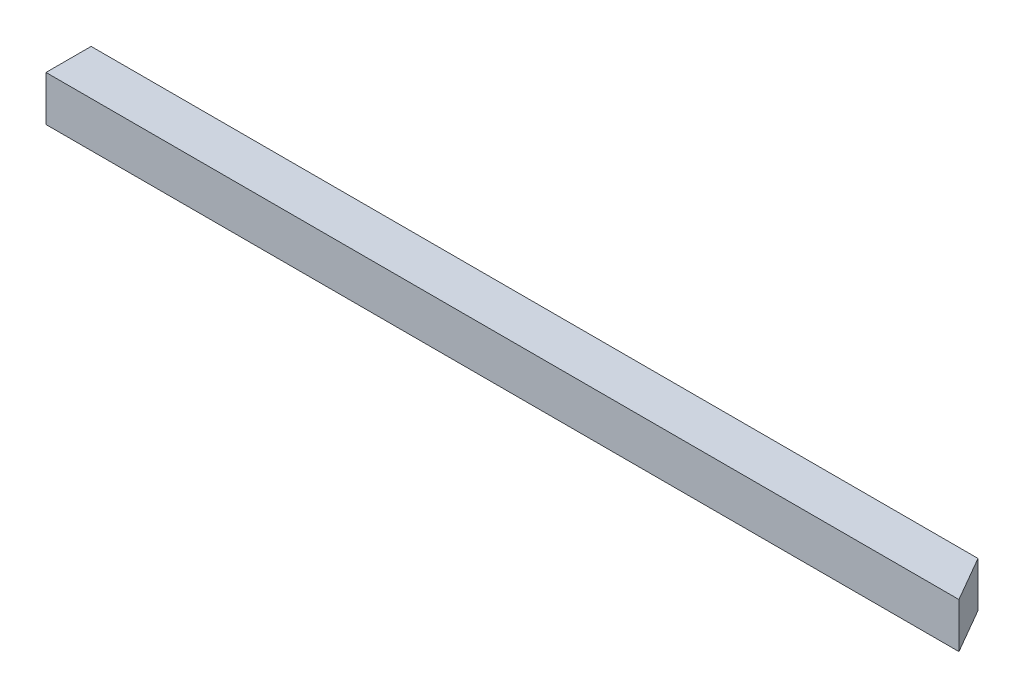
ISO-10303-21;
HEADER;
FILE_DESCRIPTION(('STEP AP214'),'2;1');
FILE_NAME('part.step','',(''),(''),'','','');
FILE_SCHEMA(('AUTOMOTIVE_DESIGN { 1 0 10303 214 1 1 1 1 }'));
ENDSEC;
DATA;
#1=APPLICATION_CONTEXT('core data for automotive mechanical design processes');
#2=APPLICATION_PROTOCOL_DEFINITION('international standard','automotive_design',2000,#1);
#3=PRODUCT_CONTEXT('',#1,'mechanical');
#4=PRODUCT('Part','Part','',(#3));
#5=PRODUCT_RELATED_PRODUCT_CATEGORY('part','',(#4));
#6=PRODUCT_DEFINITION_FORMATION('','',#4);
#7=PRODUCT_DEFINITION_CONTEXT('part definition',#1,'design');
#8=PRODUCT_DEFINITION('design','',#6,#7);
#9=PRODUCT_DEFINITION_SHAPE('','',#8);
#10=(LENGTH_UNIT() NAMED_UNIT(*) SI_UNIT(.MILLI.,.METRE.));
#11=(NAMED_UNIT(*) PLANE_ANGLE_UNIT() SI_UNIT($,.RADIAN.));
#12=(NAMED_UNIT(*) SI_UNIT($,.STERADIAN.) SOLID_ANGLE_UNIT());
#13=UNCERTAINTY_MEASURE_WITH_UNIT(LENGTH_MEASURE(1.E-05),#10,'distance_accuracy_value','');
#14=(GEOMETRIC_REPRESENTATION_CONTEXT(3) GLOBAL_UNCERTAINTY_ASSIGNED_CONTEXT((#13)) GLOBAL_UNIT_ASSIGNED_CONTEXT((#10,
#11,#12)) REPRESENTATION_CONTEXT('',''));
#15=CARTESIAN_POINT('',(0.,0.,0.));
#16=DIRECTION('',(0.,0.,1.));
#17=DIRECTION('',(1.,0.,0.));
#18=AXIS2_PLACEMENT_3D('',#15,#16,#17);
#19=CARTESIAN_POINT('',(503.094010767587,20.,563.730669589463));
#20=DIRECTION('',(-0.866025403784437,0.,0.500000000000003));
#21=DIRECTION('',(0.500000000000003,0.,0.866025403784437));
#22=AXIS2_PLACEMENT_3D('',#19,#20,#21);
#23=PLANE('',#22);
#24=DIRECTION('',(-0.500000000000003,0.,-0.866025403784437));
#25=VECTOR('',#24,1.);
#26=CARTESIAN_POINT('',(503.094010767587,0.,563.730669589463));
#27=LINE('',#26,#25);
#28=CARTESIAN_POINT('',(514.64101615138,0.,583.730669589463));
#29=VERTEX_POINT('',#28);
#30=CARTESIAN_POINT('',(503.094010767587,0.,563.730669589463));
#31=VERTEX_POINT('',#30);
#32=EDGE_CURVE('E90',#29,#31,#27,.T.);
#33=ORIENTED_EDGE('',*,*,#32,.T.);
#34=DIRECTION('',(0.,-1.,0.));
#35=VECTOR('',#34,1.);
#36=CARTESIAN_POINT('',(503.094010767587,20.,563.730669589463));
#37=LINE('',#36,#35);
#38=CARTESIAN_POINT('',(503.094010767587,20.,563.730669589463));
#39=VERTEX_POINT('',#38);
#40=EDGE_CURVE('E44',#39,#31,#37,.T.);
#41=ORIENTED_EDGE('',*,*,#40,.F.);
#42=DIRECTION('',(-0.500000000000003,0.,-0.866025403784437));
#43=VECTOR('',#42,1.);
#44=CARTESIAN_POINT('',(503.094010767587,20.,563.730669589463));
#45=LINE('',#44,#43);
#46=CARTESIAN_POINT('',(514.64101615138,20.,583.730669589463));
#47=VERTEX_POINT('',#46);
#48=EDGE_CURVE('E82',#47,#39,#45,.T.);
#49=ORIENTED_EDGE('',*,*,#48,.F.);
#50=DIRECTION('',(0.,-1.,0.));
#51=VECTOR('',#50,1.);
#52=CARTESIAN_POINT('',(514.64101615138,20.,583.730669589463));
#53=LINE('',#52,#51);
#54=EDGE_CURVE('E11',#47,#29,#53,.T.);
#55=ORIENTED_EDGE('',*,*,#54,.T.);
#56=EDGE_LOOP('',(#33,#41,#49,#55));
#57=FACE_BOUND('',#56,.T.);
#58=ADVANCED_FACE('F36',(#57),#23,.F.);
#59=CARTESIAN_POINT('',(110.000000000002,20.,563.730669589463));
#60=DIRECTION('',(0.,0.,1.));
#61=DIRECTION('',(1.,0.,0.));
#62=AXIS2_PLACEMENT_3D('',#59,#60,#61);
#63=PLANE('',#62);
#64=DIRECTION('',(-1.,0.,0.));
#65=VECTOR('',#64,1.);
#66=CARTESIAN_POINT('',(110.000000000002,0.,563.730669589463));
#67=LINE('',#66,#65);
#68=CARTESIAN_POINT('',(110.000000000002,0.,563.730669589463));
#69=VERTEX_POINT('',#68);
#70=EDGE_CURVE('E69',#31,#69,#67,.T.);
#71=ORIENTED_EDGE('',*,*,#70,.T.);
#72=DIRECTION('',(0.,-1.,0.));
#73=VECTOR('',#72,1.);
#74=CARTESIAN_POINT('',(110.000000000002,20.,563.730669589463));
#75=LINE('',#74,#73);
#76=CARTESIAN_POINT('',(110.000000000002,20.,563.730669589463));
#77=VERTEX_POINT('',#76);
#78=EDGE_CURVE('E91',#77,#69,#75,.T.);
#79=ORIENTED_EDGE('',*,*,#78,.F.);
#80=DIRECTION('',(-1.,0.,0.));
#81=VECTOR('',#80,1.);
#82=CARTESIAN_POINT('',(480.000000000002,20.,563.730669589463));
#83=LINE('',#82,#81);
#84=EDGE_CURVE('E86',#39,#77,#83,.T.);
#85=ORIENTED_EDGE('',*,*,#84,.F.);
#86=ORIENTED_EDGE('',*,*,#40,.T.);
#87=EDGE_LOOP('',(#71,#79,#85,#86));
#88=FACE_BOUND('',#87,.T.);
#89=ADVANCED_FACE('F92',(#88),#63,.F.);
#90=CARTESIAN_POINT('',(110.000000000002,20.,563.730669589463));
#91=DIRECTION('',(1.,0.,0.));
#92=DIRECTION('',(0.,0.,-1.));
#93=AXIS2_PLACEMENT_3D('',#90,#91,#92);
#94=PLANE('',#93);
#95=DIRECTION('',(0.,0.,1.));
#96=VECTOR('',#95,1.);
#97=CARTESIAN_POINT('',(110.000000000002,0.,563.730669589463));
#98=LINE('',#97,#96);
#99=CARTESIAN_POINT('',(110.000000000002,0.,583.730669589463));
#100=VERTEX_POINT('',#99);
#101=EDGE_CURVE('E76',#69,#100,#98,.T.);
#102=ORIENTED_EDGE('',*,*,#101,.T.);
#103=DIRECTION('',(0.,-1.,0.));
#104=VECTOR('',#103,1.);
#105=CARTESIAN_POINT('',(110.000000000002,20.,583.730669589463));
#106=LINE('',#105,#104);
#107=CARTESIAN_POINT('',(110.000000000002,20.,583.730669589463));
#108=VERTEX_POINT('',#107);
#109=EDGE_CURVE('E96',#108,#100,#106,.T.);
#110=ORIENTED_EDGE('',*,*,#109,.F.);
#111=DIRECTION('',(0.,0.,1.));
#112=VECTOR('',#111,1.);
#113=CARTESIAN_POINT('',(110.000000000002,20.,563.730669589463));
#114=LINE('',#113,#112);
#115=EDGE_CURVE('E94',#77,#108,#114,.T.);
#116=ORIENTED_EDGE('',*,*,#115,.F.);
#117=ORIENTED_EDGE('',*,*,#78,.T.);
#118=EDGE_LOOP('',(#102,#110,#116,#117));
#119=FACE_BOUND('',#118,.T.);
#120=ADVANCED_FACE('F106',(#119),#94,.F.);
#121=CARTESIAN_POINT('',(110.000000000002,20.,583.730669589463));
#122=DIRECTION('',(0.,0.,-1.));
#123=DIRECTION('',(-1.,0.,0.));
#124=AXIS2_PLACEMENT_3D('',#121,#122,#123);
#125=PLANE('',#124);
#126=DIRECTION('',(1.,0.,0.));
#127=VECTOR('',#126,1.);
#128=CARTESIAN_POINT('',(110.000000000002,0.,583.730669589463));
#129=LINE('',#128,#127);
#130=EDGE_CURVE('E103',#100,#29,#129,.T.);
#131=ORIENTED_EDGE('',*,*,#130,.T.);
#132=ORIENTED_EDGE('',*,*,#54,.F.);
#133=DIRECTION('',(1.,0.,0.));
#134=VECTOR('',#133,1.);
#135=CARTESIAN_POINT('',(514.64101615138,20.,583.730669589463));
#136=LINE('',#135,#134);
#137=EDGE_CURVE('E52',#108,#47,#136,.T.);
#138=ORIENTED_EDGE('',*,*,#137,.F.);
#139=ORIENTED_EDGE('',*,*,#109,.T.);
#140=EDGE_LOOP('',(#131,#132,#138,#139));
#141=FACE_BOUND('',#140,.T.);
#142=ADVANCED_FACE('F110',(#141),#125,.F.);
#143=CARTESIAN_POINT('',(0.,20.,0.));
#144=DIRECTION('',(0.,1.,0.));
#145=DIRECTION('',(0.,0.,1.));
#146=AXIS2_PLACEMENT_3D('',#143,#144,#145);
#147=PLANE('',#146);
#148=ORIENTED_EDGE('',*,*,#137,.T.);
#149=ORIENTED_EDGE('',*,*,#48,.T.);
#150=ORIENTED_EDGE('',*,*,#84,.T.);
#151=ORIENTED_EDGE('',*,*,#115,.T.);
#152=EDGE_LOOP('',(#148,#149,#150,#151));
#153=FACE_BOUND('',#152,.T.);
#154=ADVANCED_FACE('F84',(#153),#147,.T.);
#155=CARTESIAN_POINT('',(0.,0.,0.));
#156=DIRECTION('',(0.,1.,0.));
#157=DIRECTION('',(0.,0.,1.));
#158=AXIS2_PLACEMENT_3D('',#155,#156,#157);
#159=PLANE('',#158);
#160=ORIENTED_EDGE('',*,*,#32,.F.);
#161=ORIENTED_EDGE('',*,*,#130,.F.);
#162=ORIENTED_EDGE('',*,*,#101,.F.);
#163=ORIENTED_EDGE('',*,*,#70,.F.);
#164=EDGE_LOOP('',(#160,#161,#162,#163));
#165=FACE_BOUND('',#164,.T.);
#166=ADVANCED_FACE('F109',(#165),#159,.F.);
#167=CLOSED_SHELL('',(#58,#89,#120,#142,#154,#166));
#168=MANIFOLD_SOLID_BREP('B2',#167);
#169=ADVANCED_BREP_SHAPE_REPRESENTATION('',(#18,#168),#14);
#170=SHAPE_DEFINITION_REPRESENTATION(#9,#169);
ENDSEC;
END-ISO-10303-21;
